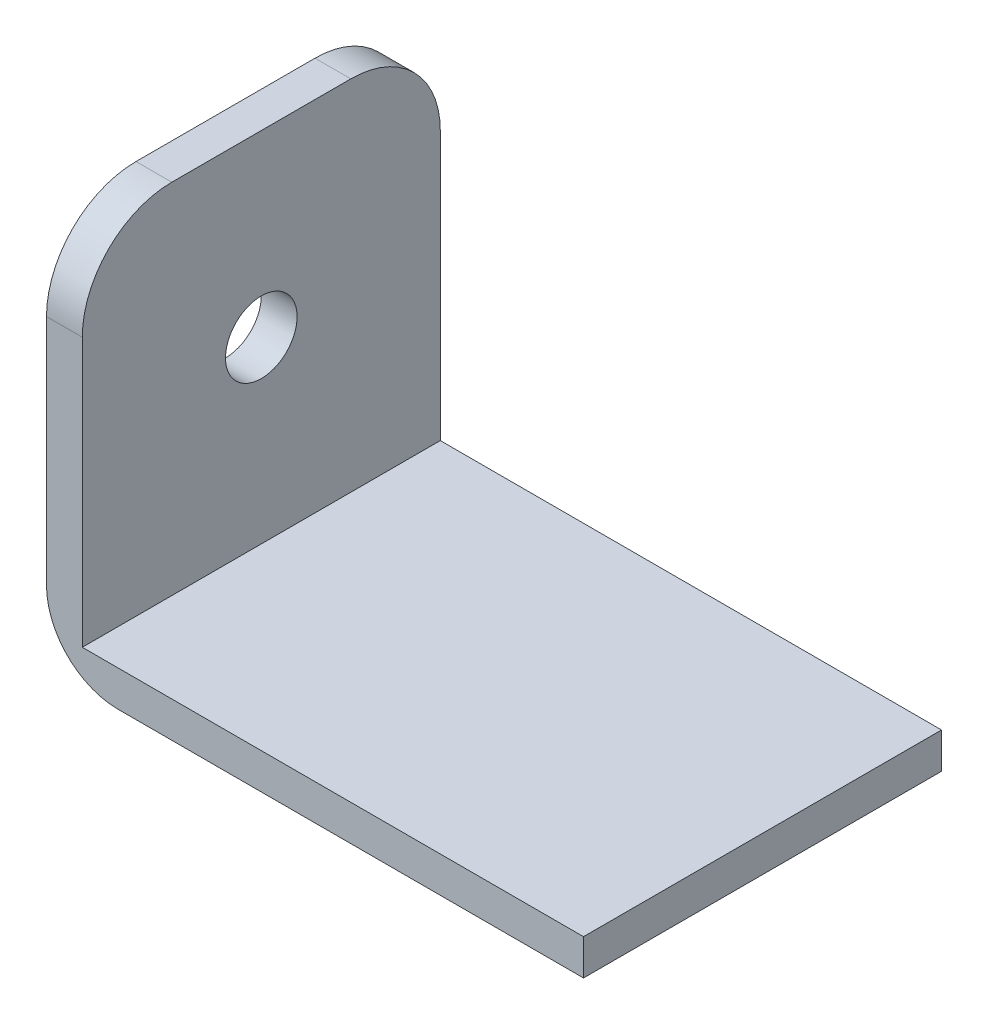
ISO-10303-21;
HEADER;
FILE_DESCRIPTION(('STEP AP214'),'2;1');
FILE_NAME('part.step','',(''),(''),'','','');
FILE_SCHEMA(('AUTOMOTIVE_DESIGN { 1 0 10303 214 1 1 1 1 }'));
ENDSEC;
DATA;
#1=APPLICATION_CONTEXT('core data for automotive mechanical design processes');
#2=APPLICATION_PROTOCOL_DEFINITION('international standard','automotive_design',2000,#1);
#3=PRODUCT_CONTEXT('',#1,'mechanical');
#4=PRODUCT('Part','Part','',(#3));
#5=PRODUCT_RELATED_PRODUCT_CATEGORY('part','',(#4));
#6=PRODUCT_DEFINITION_FORMATION('','',#4);
#7=PRODUCT_DEFINITION_CONTEXT('part definition',#1,'design');
#8=PRODUCT_DEFINITION('design','',#6,#7);
#9=PRODUCT_DEFINITION_SHAPE('','',#8);
#10=(LENGTH_UNIT() NAMED_UNIT(*) SI_UNIT(.MILLI.,.METRE.));
#11=(NAMED_UNIT(*) PLANE_ANGLE_UNIT() SI_UNIT($,.RADIAN.));
#12=(NAMED_UNIT(*) SI_UNIT($,.STERADIAN.) SOLID_ANGLE_UNIT());
#13=UNCERTAINTY_MEASURE_WITH_UNIT(LENGTH_MEASURE(1.E-05),#10,'distance_accuracy_value','');
#14=(GEOMETRIC_REPRESENTATION_CONTEXT(3) GLOBAL_UNCERTAINTY_ASSIGNED_CONTEXT((#13)) GLOBAL_UNIT_ASSIGNED_CONTEXT((#10,
#11,#12)) REPRESENTATION_CONTEXT('',''));
#15=CARTESIAN_POINT('',(0.,0.,0.));
#16=DIRECTION('',(0.,0.,1.));
#17=DIRECTION('',(1.,0.,0.));
#18=AXIS2_PLACEMENT_3D('',#15,#16,#17);
#19=CARTESIAN_POINT('',(0.,0.,50.));
#20=DIRECTION('',(1.,0.,0.));
#21=DIRECTION('',(0.,1.,0.));
#22=AXIS2_PLACEMENT_3D('',#19,#20,#21);
#23=PLANE('',#22);
#24=CARTESIAN_POINT('',(0.,-25.,25.));
#25=DIRECTION('',(-1.,0.,0.));
#26=DIRECTION('',(0.,-1.,0.));
#27=AXIS2_PLACEMENT_3D('',#24,#25,#26);
#28=CIRCLE('',#27,5.);
#29=CARTESIAN_POINT('',(0.,-30.,25.));
#30=VERTEX_POINT('',#29);
#31=EDGE_CURVE('E314',#30,#30,#28,.T.);
#32=ORIENTED_EDGE('',*,*,#31,.F.);
#33=EDGE_LOOP('',(#32));
#34=FACE_BOUND('',#33,.T.);
#35=DIRECTION('',(0.,0.,-1.));
#36=VECTOR('',#35,1.);
#37=CARTESIAN_POINT('',(0.,0.,50.));
#38=LINE('',#37,#36);
#39=CARTESIAN_POINT('',(0.,0.,37.5));
#40=VERTEX_POINT('',#39);
#41=CARTESIAN_POINT('',(0.,0.,12.5));
#42=VERTEX_POINT('',#41);
#43=EDGE_CURVE('E143',#40,#42,#38,.T.);
#44=ORIENTED_EDGE('',*,*,#43,.T.);
#45=CARTESIAN_POINT('',(0.,-12.5,12.5));
#46=DIRECTION('',(1.,0.,0.));
#47=DIRECTION('',(0.,1.,0.));
#48=AXIS2_PLACEMENT_3D('',#45,#46,#47);
#49=CIRCLE('',#48,12.5);
#50=CARTESIAN_POINT('',(0.,-12.5,0.));
#51=VERTEX_POINT('',#50);
#52=EDGE_CURVE('E47',#42,#51,#49,.F.);
#53=ORIENTED_EDGE('',*,*,#52,.T.);
#54=DIRECTION('',(0.,-1.,0.));
#55=VECTOR('',#54,1.);
#56=CARTESIAN_POINT('',(0.,0.,0.));
#57=LINE('',#56,#55);
#58=CARTESIAN_POINT('',(0.,-45.,0.));
#59=VERTEX_POINT('',#58);
#60=EDGE_CURVE('E144',#51,#59,#57,.T.);
#61=ORIENTED_EDGE('',*,*,#60,.T.);
#62=DIRECTION('',(0.,0.,-1.));
#63=VECTOR('',#62,1.);
#64=CARTESIAN_POINT('',(0.,-45.,50.));
#65=LINE('',#64,#63);
#66=CARTESIAN_POINT('',(0.,-45.,50.));
#67=VERTEX_POINT('',#66);
#68=EDGE_CURVE('E166',#59,#67,#65,.F.);
#69=ORIENTED_EDGE('',*,*,#68,.T.);
#70=DIRECTION('',(0.,-1.,0.));
#71=VECTOR('',#70,1.);
#72=CARTESIAN_POINT('',(0.,0.,50.));
#73=LINE('',#72,#71);
#74=CARTESIAN_POINT('',(0.,-12.5,50.));
#75=VERTEX_POINT('',#74);
#76=EDGE_CURVE('E121',#75,#67,#73,.T.);
#77=ORIENTED_EDGE('',*,*,#76,.F.);
#78=CARTESIAN_POINT('',(0.,-12.5,37.5));
#79=DIRECTION('',(1.,0.,0.));
#80=DIRECTION('',(0.,1.,0.));
#81=AXIS2_PLACEMENT_3D('',#78,#79,#80);
#82=CIRCLE('',#81,12.5);
#83=EDGE_CURVE('E181',#75,#40,#82,.F.);
#84=ORIENTED_EDGE('',*,*,#83,.T.);
#85=EDGE_LOOP('',(#44,#53,#61,#69,#77,#84));
#86=FACE_BOUND('',#85,.T.);
#87=ADVANCED_FACE('F39',(#34,#86),#23,.F.);
#88=CARTESIAN_POINT('',(0.,-55.,50.));
#89=DIRECTION('',(0.,1.,0.));
#90=DIRECTION('',(0.,0.,1.));
#91=AXIS2_PLACEMENT_3D('',#88,#89,#90);
#92=PLANE('',#91);
#93=DIRECTION('',(1.,0.,0.));
#94=VECTOR('',#93,1.);
#95=CARTESIAN_POINT('',(0.,-55.,50.));
#96=LINE('',#95,#94);
#97=CARTESIAN_POINT('',(10.,-55.,50.));
#98=VERTEX_POINT('',#97);
#99=CARTESIAN_POINT('',(75.,-55.,50.));
#100=VERTEX_POINT('',#99);
#101=EDGE_CURVE('E109',#98,#100,#96,.T.);
#102=ORIENTED_EDGE('',*,*,#101,.F.);
#103=DIRECTION('',(0.,0.,-1.));
#104=VECTOR('',#103,1.);
#105=CARTESIAN_POINT('',(10.,-55.,50.));
#106=LINE('',#105,#104);
#107=CARTESIAN_POINT('',(10.,-55.,0.));
#108=VERTEX_POINT('',#107);
#109=EDGE_CURVE('E131',#98,#108,#106,.T.);
#110=ORIENTED_EDGE('',*,*,#109,.T.);
#111=DIRECTION('',(1.,0.,0.));
#112=VECTOR('',#111,1.);
#113=CARTESIAN_POINT('',(0.,-55.,0.));
#114=LINE('',#113,#112);
#115=CARTESIAN_POINT('',(75.,-55.,0.));
#116=VERTEX_POINT('',#115);
#117=EDGE_CURVE('E127',#108,#116,#114,.T.);
#118=ORIENTED_EDGE('',*,*,#117,.T.);
#119=DIRECTION('',(0.,0.,-1.));
#120=VECTOR('',#119,1.);
#121=CARTESIAN_POINT('',(75.,-55.,50.));
#122=LINE('',#121,#120);
#123=EDGE_CURVE('E124',#100,#116,#122,.T.);
#124=ORIENTED_EDGE('',*,*,#123,.F.);
#125=EDGE_LOOP('',(#102,#110,#118,#124));
#126=FACE_BOUND('',#125,.T.);
#127=ADVANCED_FACE('F125',(#126),#92,.F.);
#128=CARTESIAN_POINT('',(75.,0.,50.));
#129=DIRECTION('',(-1.,0.,0.));
#130=DIRECTION('',(0.,0.,1.));
#131=AXIS2_PLACEMENT_3D('',#128,#129,#130);
#132=PLANE('',#131);
#133=DIRECTION('',(0.,1.,0.));
#134=VECTOR('',#133,1.);
#135=CARTESIAN_POINT('',(75.,0.,0.));
#136=LINE('',#135,#134);
#137=CARTESIAN_POINT('',(75.,-50.,0.));
#138=VERTEX_POINT('',#137);
#139=EDGE_CURVE('E148',#116,#138,#136,.T.);
#140=ORIENTED_EDGE('',*,*,#139,.T.);
#141=DIRECTION('',(0.,0.,-1.));
#142=VECTOR('',#141,1.);
#143=CARTESIAN_POINT('',(75.,-50.,50.));
#144=LINE('',#143,#142);
#145=CARTESIAN_POINT('',(75.,-50.,50.));
#146=VERTEX_POINT('',#145);
#147=EDGE_CURVE('E132',#146,#138,#144,.T.);
#148=ORIENTED_EDGE('',*,*,#147,.F.);
#149=DIRECTION('',(0.,1.,0.));
#150=VECTOR('',#149,1.);
#151=CARTESIAN_POINT('',(75.,0.,50.));
#152=LINE('',#151,#150);
#153=EDGE_CURVE('E114',#100,#146,#152,.T.);
#154=ORIENTED_EDGE('',*,*,#153,.F.);
#155=ORIENTED_EDGE('',*,*,#123,.T.);
#156=EDGE_LOOP('',(#140,#148,#154,#155));
#157=FACE_BOUND('',#156,.T.);
#158=ADVANCED_FACE('F134',(#157),#132,.F.);
#159=CARTESIAN_POINT('',(0.,-50.,50.));
#160=DIRECTION('',(0.,1.,0.));
#161=DIRECTION('',(0.,0.,1.));
#162=AXIS2_PLACEMENT_3D('',#159,#160,#161);
#163=PLANE('',#162);
#164=DIRECTION('',(1.,0.,0.));
#165=VECTOR('',#164,1.);
#166=CARTESIAN_POINT('',(0.,-50.,0.));
#167=LINE('',#166,#165);
#168=CARTESIAN_POINT('',(5.00000000000001,-50.,0.));
#169=VERTEX_POINT('',#168);
#170=EDGE_CURVE('E150',#169,#138,#167,.T.);
#171=ORIENTED_EDGE('',*,*,#170,.F.);
#172=DIRECTION('',(0.,0.,-1.));
#173=VECTOR('',#172,1.);
#174=CARTESIAN_POINT('',(5.00000000000001,-50.,50.));
#175=LINE('',#174,#173);
#176=CARTESIAN_POINT('',(5.00000000000001,-50.,50.));
#177=VERTEX_POINT('',#176);
#178=EDGE_CURVE('E158',#177,#169,#175,.T.);
#179=ORIENTED_EDGE('',*,*,#178,.F.);
#180=DIRECTION('',(1.,0.,0.));
#181=VECTOR('',#180,1.);
#182=CARTESIAN_POINT('',(0.,-50.,50.));
#183=LINE('',#182,#181);
#184=EDGE_CURVE('E136',#177,#146,#183,.T.);
#185=ORIENTED_EDGE('',*,*,#184,.T.);
#186=ORIENTED_EDGE('',*,*,#147,.T.);
#187=EDGE_LOOP('',(#171,#179,#185,#186));
#188=FACE_BOUND('',#187,.T.);
#189=ADVANCED_FACE('F202',(#188),#163,.T.);
#190=CARTESIAN_POINT('',(5.,0.,50.));
#191=DIRECTION('',(1.,0.,0.));
#192=DIRECTION('',(0.,1.,0.));
#193=AXIS2_PLACEMENT_3D('',#190,#191,#192);
#194=PLANE('',#193);
#195=CARTESIAN_POINT('',(5.,-25.,25.));
#196=DIRECTION('',(-1.,0.,0.));
#197=DIRECTION('',(0.,-1.,0.));
#198=AXIS2_PLACEMENT_3D('',#195,#196,#197);
#199=CIRCLE('',#198,5.);
#200=CARTESIAN_POINT('',(5.,-30.,25.));
#201=VERTEX_POINT('',#200);
#202=EDGE_CURVE('E146',#201,#201,#199,.T.);
#203=ORIENTED_EDGE('',*,*,#202,.T.);
#204=EDGE_LOOP('',(#203));
#205=FACE_BOUND('',#204,.T.);
#206=DIRECTION('',(0.,-1.,0.));
#207=VECTOR('',#206,1.);
#208=CARTESIAN_POINT('',(5.,0.,0.));
#209=LINE('',#208,#207);
#210=CARTESIAN_POINT('',(5.,-12.5,0.));
#211=VERTEX_POINT('',#210);
#212=EDGE_CURVE('E153',#211,#169,#209,.T.);
#213=ORIENTED_EDGE('',*,*,#212,.F.);
#214=CARTESIAN_POINT('',(5.,-12.5,12.5));
#215=DIRECTION('',(1.,0.,0.));
#216=DIRECTION('',(0.,1.,0.));
#217=AXIS2_PLACEMENT_3D('',#214,#215,#216);
#218=CIRCLE('',#217,12.5);
#219=CARTESIAN_POINT('',(5.,0.,12.5));
#220=VERTEX_POINT('',#219);
#221=EDGE_CURVE('E175',#211,#220,#218,.T.);
#222=ORIENTED_EDGE('',*,*,#221,.T.);
#223=DIRECTION('',(0.,0.,-1.));
#224=VECTOR('',#223,1.);
#225=CARTESIAN_POINT('',(5.,0.,50.));
#226=LINE('',#225,#224);
#227=CARTESIAN_POINT('',(5.,0.,37.5));
#228=VERTEX_POINT('',#227);
#229=EDGE_CURVE('E156',#228,#220,#226,.T.);
#230=ORIENTED_EDGE('',*,*,#229,.F.);
#231=CARTESIAN_POINT('',(5.,-12.5,37.5));
#232=DIRECTION('',(1.,0.,0.));
#233=DIRECTION('',(0.,1.,0.));
#234=AXIS2_PLACEMENT_3D('',#231,#232,#233);
#235=CIRCLE('',#234,12.5);
#236=CARTESIAN_POINT('',(5.,-12.5,50.));
#237=VERTEX_POINT('',#236);
#238=EDGE_CURVE('E173',#228,#237,#235,.T.);
#239=ORIENTED_EDGE('',*,*,#238,.T.);
#240=DIRECTION('',(0.,-1.,0.));
#241=VECTOR('',#240,1.);
#242=CARTESIAN_POINT('',(5.,0.,50.));
#243=LINE('',#242,#241);
#244=EDGE_CURVE('E138',#237,#177,#243,.T.);
#245=ORIENTED_EDGE('',*,*,#244,.T.);
#246=ORIENTED_EDGE('',*,*,#178,.T.);
#247=EDGE_LOOP('',(#213,#222,#230,#239,#245,#246));
#248=FACE_BOUND('',#247,.T.);
#249=ADVANCED_FACE('F194',(#205,#248),#194,.T.);
#250=CARTESIAN_POINT('',(0.,0.,50.));
#251=DIRECTION('',(0.,1.,0.));
#252=DIRECTION('',(0.,0.,1.));
#253=AXIS2_PLACEMENT_3D('',#250,#251,#252);
#254=PLANE('',#253);
#255=ORIENTED_EDGE('',*,*,#229,.T.);
#256=DIRECTION('',(1.,0.,0.));
#257=VECTOR('',#256,1.);
#258=CARTESIAN_POINT('',(0.,0.,12.5));
#259=LINE('',#258,#257);
#260=EDGE_CURVE('E60',#220,#42,#259,.F.);
#261=ORIENTED_EDGE('',*,*,#260,.T.);
#262=ORIENTED_EDGE('',*,*,#43,.F.);
#263=DIRECTION('',(1.,0.,0.));
#264=VECTOR('',#263,1.);
#265=CARTESIAN_POINT('',(0.,0.,37.5));
#266=LINE('',#265,#264);
#267=EDGE_CURVE('E177',#40,#228,#266,.T.);
#268=ORIENTED_EDGE('',*,*,#267,.T.);
#269=EDGE_LOOP('',(#255,#261,#262,#268));
#270=FACE_BOUND('',#269,.T.);
#271=ADVANCED_FACE('F195',(#270),#254,.T.);
#272=CARTESIAN_POINT('',(0.,0.,50.));
#273=DIRECTION('',(0.,0.,1.));
#274=DIRECTION('',(1.,0.,0.));
#275=AXIS2_PLACEMENT_3D('',#272,#273,#274);
#276=PLANE('',#275);
#277=ORIENTED_EDGE('',*,*,#244,.F.);
#278=DIRECTION('',(1.,0.,0.));
#279=VECTOR('',#278,1.);
#280=CARTESIAN_POINT('',(0.,-12.5,50.));
#281=LINE('',#280,#279);
#282=EDGE_CURVE('E11',#237,#75,#281,.F.);
#283=ORIENTED_EDGE('',*,*,#282,.T.);
#284=ORIENTED_EDGE('',*,*,#76,.T.);
#285=CARTESIAN_POINT('',(10.,-45.,50.));
#286=DIRECTION('',(0.,0.,1.));
#287=DIRECTION('',(1.,0.,0.));
#288=AXIS2_PLACEMENT_3D('',#285,#286,#287);
#289=CIRCLE('',#288,10.);
#290=EDGE_CURVE('E117',#67,#98,#289,.T.);
#291=ORIENTED_EDGE('',*,*,#290,.T.);
#292=ORIENTED_EDGE('',*,*,#101,.T.);
#293=ORIENTED_EDGE('',*,*,#153,.T.);
#294=ORIENTED_EDGE('',*,*,#184,.F.);
#295=EDGE_LOOP('',(#277,#283,#284,#291,#292,#293,#294));
#296=FACE_BOUND('',#295,.T.);
#297=ADVANCED_FACE('F111',(#296),#276,.T.);
#298=CARTESIAN_POINT('',(0.,0.,0.));
#299=DIRECTION('',(0.,0.,1.));
#300=DIRECTION('',(1.,0.,0.));
#301=AXIS2_PLACEMENT_3D('',#298,#299,#300);
#302=PLANE('',#301);
#303=ORIENTED_EDGE('',*,*,#60,.F.);
#304=DIRECTION('',(1.,0.,0.));
#305=VECTOR('',#304,1.);
#306=CARTESIAN_POINT('',(5.,-12.5,0.));
#307=LINE('',#306,#305);
#308=EDGE_CURVE('E170',#51,#211,#307,.T.);
#309=ORIENTED_EDGE('',*,*,#308,.T.);
#310=ORIENTED_EDGE('',*,*,#212,.T.);
#311=ORIENTED_EDGE('',*,*,#170,.T.);
#312=ORIENTED_EDGE('',*,*,#139,.F.);
#313=ORIENTED_EDGE('',*,*,#117,.F.);
#314=CARTESIAN_POINT('',(10.,-45.,0.));
#315=DIRECTION('',(0.,0.,1.));
#316=DIRECTION('',(1.,0.,0.));
#317=AXIS2_PLACEMENT_3D('',#314,#315,#316);
#318=CIRCLE('',#317,10.);
#319=EDGE_CURVE('E163',#108,#59,#318,.F.);
#320=ORIENTED_EDGE('',*,*,#319,.T.);
#321=EDGE_LOOP('',(#303,#309,#310,#311,#312,#313,#320));
#322=FACE_BOUND('',#321,.T.);
#323=ADVANCED_FACE('F188',(#322),#302,.F.);
#324=CARTESIAN_POINT('',(5.,-25.,25.));
#325=DIRECTION('',(-1.,0.,0.));
#326=DIRECTION('',(0.,-1.,0.));
#327=AXIS2_PLACEMENT_3D('',#324,#325,#326);
#328=CYLINDRICAL_SURFACE('',#327,5.);
#329=ORIENTED_EDGE('',*,*,#202,.F.);
#330=EDGE_LOOP('',(#329));
#331=FACE_BOUND('',#330,.T.);
#332=ORIENTED_EDGE('',*,*,#31,.T.);
#333=EDGE_LOOP('',(#332));
#334=FACE_BOUND('',#333,.T.);
#335=ADVANCED_FACE('F223',(#331,#334),#328,.F.);
#336=CARTESIAN_POINT('',(10.,-45.,50.));
#337=DIRECTION('',(0.,0.,-1.));
#338=DIRECTION('',(-1.,0.,0.));
#339=AXIS2_PLACEMENT_3D('',#336,#337,#338);
#340=CYLINDRICAL_SURFACE('',#339,10.);
#341=ORIENTED_EDGE('',*,*,#290,.F.);
#342=ORIENTED_EDGE('',*,*,#68,.F.);
#343=ORIENTED_EDGE('',*,*,#319,.F.);
#344=ORIENTED_EDGE('',*,*,#109,.F.);
#345=EDGE_LOOP('',(#341,#342,#343,#344));
#346=FACE_BOUND('',#345,.T.);
#347=ADVANCED_FACE('F221',(#346),#340,.T.);
#348=CARTESIAN_POINT('',(0.,-12.5,12.5));
#349=DIRECTION('',(-1.,0.,0.));
#350=DIRECTION('',(0.,0.,1.));
#351=AXIS2_PLACEMENT_3D('',#348,#349,#350);
#352=CYLINDRICAL_SURFACE('',#351,12.5);
#353=ORIENTED_EDGE('',*,*,#52,.F.);
#354=ORIENTED_EDGE('',*,*,#260,.F.);
#355=ORIENTED_EDGE('',*,*,#221,.F.);
#356=ORIENTED_EDGE('',*,*,#308,.F.);
#357=EDGE_LOOP('',(#353,#354,#355,#356));
#358=FACE_BOUND('',#357,.T.);
#359=ADVANCED_FACE('F191',(#358),#352,.T.);
#360=CARTESIAN_POINT('',(0.,-12.5,37.5));
#361=DIRECTION('',(1.,0.,0.));
#362=DIRECTION('',(0.,0.,-1.));
#363=AXIS2_PLACEMENT_3D('',#360,#361,#362);
#364=CYLINDRICAL_SURFACE('',#363,12.5);
#365=ORIENTED_EDGE('',*,*,#83,.F.);
#366=ORIENTED_EDGE('',*,*,#282,.F.);
#367=ORIENTED_EDGE('',*,*,#238,.F.);
#368=ORIENTED_EDGE('',*,*,#267,.F.);
#369=EDGE_LOOP('',(#365,#366,#367,#368));
#370=FACE_BOUND('',#369,.T.);
#371=ADVANCED_FACE('F41',(#370),#364,.T.);
#372=CLOSED_SHELL('',(#87,#127,#158,#189,#249,#271,#297,#323,#335,#347,#359,#371));
#373=MANIFOLD_SOLID_BREP('B2',#372);
#374=ADVANCED_BREP_SHAPE_REPRESENTATION('',(#18,#373),#14);
#375=SHAPE_DEFINITION_REPRESENTATION(#9,#374);
ENDSEC;
END-ISO-10303-21;
